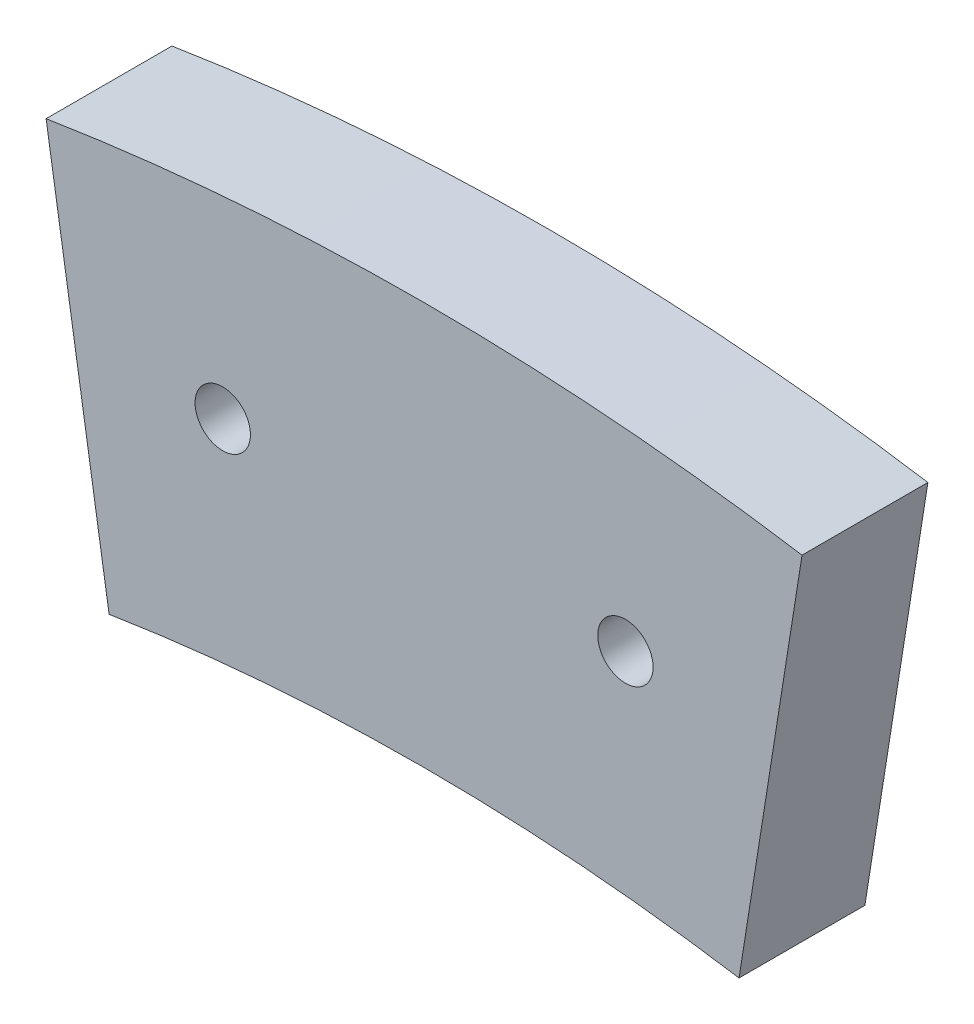
ISO-10303-21;
HEADER;
FILE_DESCRIPTION(('STEP AP214'),'2;1');
FILE_NAME('part.step','',(''),(''),'','','');
FILE_SCHEMA(('AUTOMOTIVE_DESIGN { 1 0 10303 214 1 1 1 1 }'));
ENDSEC;
DATA;
#1=APPLICATION_CONTEXT('core data for automotive mechanical design processes');
#2=APPLICATION_PROTOCOL_DEFINITION('international standard','automotive_design',2000,#1);
#3=PRODUCT_CONTEXT('',#1,'mechanical');
#4=PRODUCT('Part','Part','',(#3));
#5=PRODUCT_RELATED_PRODUCT_CATEGORY('part','',(#4));
#6=PRODUCT_DEFINITION_FORMATION('','',#4);
#7=PRODUCT_DEFINITION_CONTEXT('part definition',#1,'design');
#8=PRODUCT_DEFINITION('design','',#6,#7);
#9=PRODUCT_DEFINITION_SHAPE('','',#8);
#10=(LENGTH_UNIT() NAMED_UNIT(*) SI_UNIT(.MILLI.,.METRE.));
#11=(NAMED_UNIT(*) PLANE_ANGLE_UNIT() SI_UNIT($,.RADIAN.));
#12=(NAMED_UNIT(*) SI_UNIT($,.STERADIAN.) SOLID_ANGLE_UNIT());
#13=UNCERTAINTY_MEASURE_WITH_UNIT(LENGTH_MEASURE(1.E-05),#10,'distance_accuracy_value','');
#14=(GEOMETRIC_REPRESENTATION_CONTEXT(3) GLOBAL_UNCERTAINTY_ASSIGNED_CONTEXT((#13)) GLOBAL_UNIT_ASSIGNED_CONTEXT((#10,
#11,#12)) REPRESENTATION_CONTEXT('',''));
#15=CARTESIAN_POINT('',(0.,0.,0.));
#16=DIRECTION('',(0.,0.,1.));
#17=DIRECTION('',(1.,0.,0.));
#18=AXIS2_PLACEMENT_3D('',#15,#16,#17);
#19=CARTESIAN_POINT('',(0.,0.,5.));
#20=DIRECTION('',(0.987688340595138,-0.156434465040231,0.));
#21=DIRECTION('',(0.156434465040231,0.987688340595138,0.));
#22=AXIS2_PLACEMENT_3D('',#19,#20,#21);
#23=PLANE('',#22);
#24=DIRECTION('',(-0.156434465040231,-0.987688340595138,0.));
#25=VECTOR('',#24,1.);
#26=CARTESIAN_POINT('',(0.,0.,0.));
#27=LINE('',#26,#25);
#28=CARTESIAN_POINT('',(15.0177086438626,94.8180806971357,0.));
#29=VERTEX_POINT('',#28);
#30=CARTESIAN_POINT('',(12.5147572032189,79.0150672476135,0.));
#31=VERTEX_POINT('',#30);
#32=EDGE_CURVE('E107',#29,#31,#27,.T.);
#33=ORIENTED_EDGE('',*,*,#32,.F.);
#34=DIRECTION('',(0.,0.,-1.));
#35=VECTOR('',#34,1.);
#36=CARTESIAN_POINT('',(15.0177086438626,94.8180806971357,5.));
#37=LINE('',#36,#35);
#38=CARTESIAN_POINT('',(15.0177086438626,94.8180806971357,5.));
#39=VERTEX_POINT('',#38);
#40=EDGE_CURVE('E11',#39,#29,#37,.T.);
#41=ORIENTED_EDGE('',*,*,#40,.F.);
#42=DIRECTION('',(-0.156434465040231,-0.987688340595138,0.));
#43=VECTOR('',#42,1.);
#44=CARTESIAN_POINT('',(0.,0.,5.));
#45=LINE('',#44,#43);
#46=CARTESIAN_POINT('',(12.5147572032189,79.0150672476135,5.));
#47=VERTEX_POINT('',#46);
#48=EDGE_CURVE('E86',#39,#47,#45,.T.);
#49=ORIENTED_EDGE('',*,*,#48,.T.);
#50=DIRECTION('',(0.,0.,-1.));
#51=VECTOR('',#50,1.);
#52=CARTESIAN_POINT('',(12.5147572032189,79.0150672476135,5.));
#53=LINE('',#52,#51);
#54=EDGE_CURVE('E53',#47,#31,#53,.T.);
#55=ORIENTED_EDGE('',*,*,#54,.T.);
#56=EDGE_LOOP('',(#33,#41,#49,#55));
#57=FACE_BOUND('',#56,.T.);
#58=ADVANCED_FACE('F37',(#57),#23,.T.);
#59=CARTESIAN_POINT('',(-1.40859546249317E-12,2.51187959321442E-12,5.));
#60=DIRECTION('',(0.,0.,-1.));
#61=DIRECTION('',(-1.,0.,0.));
#62=AXIS2_PLACEMENT_3D('',#59,#60,#61);
#63=CYLINDRICAL_SURFACE('',#62,96.);
#64=CARTESIAN_POINT('',(-1.40859546249317E-12,2.51187959321442E-12,0.));
#65=DIRECTION('',(0.,0.,1.));
#66=DIRECTION('',(1.,0.,0.));
#67=AXIS2_PLACEMENT_3D('',#64,#65,#66);
#68=CIRCLE('',#67,96.);
#69=CARTESIAN_POINT('',(-15.0177086438626,94.8180806971357,0.));
#70=VERTEX_POINT('',#69);
#71=EDGE_CURVE('E92',#29,#70,#68,.T.);
#72=ORIENTED_EDGE('',*,*,#71,.T.);
#73=DIRECTION('',(0.,0.,-1.));
#74=VECTOR('',#73,1.);
#75=CARTESIAN_POINT('',(-15.0177086438626,94.8180806971357,5.));
#76=LINE('',#75,#74);
#77=CARTESIAN_POINT('',(-15.0177086438626,94.8180806971357,5.));
#78=VERTEX_POINT('',#77);
#79=EDGE_CURVE('E45',#78,#70,#76,.T.);
#80=ORIENTED_EDGE('',*,*,#79,.F.);
#81=CARTESIAN_POINT('',(-1.40859546249317E-12,2.51187959321442E-12,5.));
#82=DIRECTION('',(0.,0.,1.));
#83=DIRECTION('',(1.,0.,0.));
#84=AXIS2_PLACEMENT_3D('',#81,#82,#83);
#85=CIRCLE('',#84,96.);
#86=EDGE_CURVE('E79',#39,#78,#85,.T.);
#87=ORIENTED_EDGE('',*,*,#86,.F.);
#88=ORIENTED_EDGE('',*,*,#40,.T.);
#89=EDGE_LOOP('',(#72,#80,#87,#88));
#90=FACE_BOUND('',#89,.T.);
#91=ADVANCED_FACE('F90',(#90),#63,.T.);
#92=CARTESIAN_POINT('',(0.,0.,5.));
#93=DIRECTION('',(0.987688340595138,0.156434465040231,0.));
#94=DIRECTION('',(-0.156434465040231,0.987688340595138,0.));
#95=AXIS2_PLACEMENT_3D('',#92,#93,#94);
#96=PLANE('',#95);
#97=DIRECTION('',(0.156434465040231,-0.987688340595138,0.));
#98=VECTOR('',#97,1.);
#99=CARTESIAN_POINT('',(0.,0.,0.));
#100=LINE('',#99,#98);
#101=CARTESIAN_POINT('',(-12.5147572032189,79.0150672476135,0.));
#102=VERTEX_POINT('',#101);
#103=EDGE_CURVE('E110',#70,#102,#100,.T.);
#104=ORIENTED_EDGE('',*,*,#103,.T.);
#105=DIRECTION('',(0.,0.,-1.));
#106=VECTOR('',#105,1.);
#107=CARTESIAN_POINT('',(-12.5147572032189,79.0150672476135,5.));
#108=LINE('',#107,#106);
#109=CARTESIAN_POINT('',(-12.5147572032189,79.0150672476135,5.));
#110=VERTEX_POINT('',#109);
#111=EDGE_CURVE('E67',#110,#102,#108,.T.);
#112=ORIENTED_EDGE('',*,*,#111,.F.);
#113=DIRECTION('',(0.156434465040231,-0.987688340595138,0.));
#114=VECTOR('',#113,1.);
#115=CARTESIAN_POINT('',(0.,0.,5.));
#116=LINE('',#115,#114);
#117=EDGE_CURVE('E85',#78,#110,#116,.T.);
#118=ORIENTED_EDGE('',*,*,#117,.F.);
#119=ORIENTED_EDGE('',*,*,#79,.T.);
#120=EDGE_LOOP('',(#104,#112,#118,#119));
#121=FACE_BOUND('',#120,.T.);
#122=ADVANCED_FACE('F95',(#121),#96,.F.);
#123=CARTESIAN_POINT('',(7.99999999999859,88.0000000000025,5.));
#124=DIRECTION('',(0.,0.,-1.));
#125=DIRECTION('',(-1.,0.,0.));
#126=AXIS2_PLACEMENT_3D('',#123,#124,#125);
#127=CYLINDRICAL_SURFACE('',#126,1.10000000000062);
#128=CARTESIAN_POINT('',(7.99999999999859,88.0000000000025,5.));
#129=DIRECTION('',(0.,0.,1.));
#130=DIRECTION('',(1.,0.,0.));
#131=AXIS2_PLACEMENT_3D('',#128,#129,#130);
#132=CIRCLE('',#131,1.10000000000062);
#133=CARTESIAN_POINT('',(9.09999999999921,88.0000000000025,5.));
#134=VERTEX_POINT('',#133);
#135=EDGE_CURVE('E98',#134,#134,#132,.T.);
#136=ORIENTED_EDGE('',*,*,#135,.T.);
#137=EDGE_LOOP('',(#136));
#138=FACE_BOUND('',#137,.T.);
#139=CARTESIAN_POINT('',(7.99999999999859,88.0000000000025,0.));
#140=DIRECTION('',(0.,0.,1.));
#141=DIRECTION('',(1.,0.,0.));
#142=AXIS2_PLACEMENT_3D('',#139,#140,#141);
#143=CIRCLE('',#142,1.10000000000062);
#144=CARTESIAN_POINT('',(9.09999999999921,88.0000000000025,0.));
#145=VERTEX_POINT('',#144);
#146=EDGE_CURVE('E115',#145,#145,#143,.T.);
#147=ORIENTED_EDGE('',*,*,#146,.F.);
#148=EDGE_LOOP('',(#147));
#149=FACE_BOUND('',#148,.T.);
#150=ADVANCED_FACE('F127',(#138,#149),#127,.F.);
#151=CARTESIAN_POINT('',(-1.40859546249317E-12,2.51187959321442E-12,5.));
#152=DIRECTION('',(0.,0.,-1.));
#153=DIRECTION('',(-1.,0.,0.));
#154=AXIS2_PLACEMENT_3D('',#151,#152,#153);
#155=CYLINDRICAL_SURFACE('',#154,80.);
#156=CARTESIAN_POINT('',(-1.40859546249317E-12,2.51187959321442E-12,0.));
#157=DIRECTION('',(0.,0.,1.));
#158=DIRECTION('',(1.,0.,0.));
#159=AXIS2_PLACEMENT_3D('',#156,#157,#158);
#160=CIRCLE('',#159,80.);
#161=EDGE_CURVE('E112',#31,#102,#160,.T.);
#162=ORIENTED_EDGE('',*,*,#161,.F.);
#163=ORIENTED_EDGE('',*,*,#54,.F.);
#164=CARTESIAN_POINT('',(-1.40859546249317E-12,2.51187959321442E-12,5.));
#165=DIRECTION('',(0.,0.,1.));
#166=DIRECTION('',(1.,0.,0.));
#167=AXIS2_PLACEMENT_3D('',#164,#165,#166);
#168=CIRCLE('',#167,80.);
#169=EDGE_CURVE('E96',#47,#110,#168,.T.);
#170=ORIENTED_EDGE('',*,*,#169,.T.);
#171=ORIENTED_EDGE('',*,*,#111,.T.);
#172=EDGE_LOOP('',(#162,#163,#170,#171));
#173=FACE_BOUND('',#172,.T.);
#174=ADVANCED_FACE('F124',(#173),#155,.F.);
#175=CARTESIAN_POINT('',(-8.00000000000141,88.0000000000025,5.));
#176=DIRECTION('',(0.,0.,-1.));
#177=DIRECTION('',(-1.,0.,0.));
#178=AXIS2_PLACEMENT_3D('',#175,#176,#177);
#179=CYLINDRICAL_SURFACE('',#178,1.10000000000062);
#180=CARTESIAN_POINT('',(-8.00000000000141,88.0000000000025,5.));
#181=DIRECTION('',(0.,0.,1.));
#182=DIRECTION('',(1.,0.,0.));
#183=AXIS2_PLACEMENT_3D('',#180,#181,#182);
#184=CIRCLE('',#183,1.10000000000062);
#185=CARTESIAN_POINT('',(-6.90000000000078,88.0000000000025,5.));
#186=VERTEX_POINT('',#185);
#187=EDGE_CURVE('E104',#186,#186,#184,.F.);
#188=ORIENTED_EDGE('',*,*,#187,.F.);
#189=EDGE_LOOP('',(#188));
#190=FACE_BOUND('',#189,.T.);
#191=CARTESIAN_POINT('',(-8.00000000000141,88.0000000000025,0.));
#192=DIRECTION('',(0.,0.,1.));
#193=DIRECTION('',(1.,0.,0.));
#194=AXIS2_PLACEMENT_3D('',#191,#192,#193);
#195=CIRCLE('',#194,1.10000000000062);
#196=CARTESIAN_POINT('',(-6.90000000000078,88.0000000000025,0.));
#197=VERTEX_POINT('',#196);
#198=EDGE_CURVE('E118',#197,#197,#195,.F.);
#199=ORIENTED_EDGE('',*,*,#198,.T.);
#200=EDGE_LOOP('',(#199));
#201=FACE_BOUND('',#200,.T.);
#202=ADVANCED_FACE('F126',(#190,#201),#179,.F.);
#203=CARTESIAN_POINT('',(0.,0.,5.));
#204=DIRECTION('',(0.,0.,1.));
#205=DIRECTION('',(1.,0.,0.));
#206=AXIS2_PLACEMENT_3D('',#203,#204,#205);
#207=PLANE('',#206);
#208=ORIENTED_EDGE('',*,*,#48,.F.);
#209=ORIENTED_EDGE('',*,*,#86,.T.);
#210=ORIENTED_EDGE('',*,*,#117,.T.);
#211=ORIENTED_EDGE('',*,*,#169,.F.);
#212=EDGE_LOOP('',(#208,#209,#210,#211));
#213=FACE_BOUND('',#212,.T.);
#214=ORIENTED_EDGE('',*,*,#135,.F.);
#215=EDGE_LOOP('',(#214));
#216=FACE_BOUND('',#215,.T.);
#217=ORIENTED_EDGE('',*,*,#187,.T.);
#218=EDGE_LOOP('',(#217));
#219=FACE_BOUND('',#218,.T.);
#220=ADVANCED_FACE('F81',(#213,#216,#219),#207,.T.);
#221=CARTESIAN_POINT('',(0.,0.,0.));
#222=DIRECTION('',(0.,0.,1.));
#223=DIRECTION('',(1.,0.,0.));
#224=AXIS2_PLACEMENT_3D('',#221,#222,#223);
#225=PLANE('',#224);
#226=ORIENTED_EDGE('',*,*,#32,.T.);
#227=ORIENTED_EDGE('',*,*,#161,.T.);
#228=ORIENTED_EDGE('',*,*,#103,.F.);
#229=ORIENTED_EDGE('',*,*,#71,.F.);
#230=EDGE_LOOP('',(#226,#227,#228,#229));
#231=FACE_BOUND('',#230,.T.);
#232=ORIENTED_EDGE('',*,*,#146,.T.);
#233=EDGE_LOOP('',(#232));
#234=FACE_BOUND('',#233,.T.);
#235=ORIENTED_EDGE('',*,*,#198,.F.);
#236=EDGE_LOOP('',(#235));
#237=FACE_BOUND('',#236,.T.);
#238=ADVANCED_FACE('F170',(#231,#234,#237),#225,.F.);
#239=CLOSED_SHELL('',(#58,#91,#122,#150,#174,#202,#220,#238));
#240=MANIFOLD_SOLID_BREP('B2',#239);
#241=ADVANCED_BREP_SHAPE_REPRESENTATION('',(#18,#240),#14);
#242=SHAPE_DEFINITION_REPRESENTATION(#9,#241);
ENDSEC;
END-ISO-10303-21;
